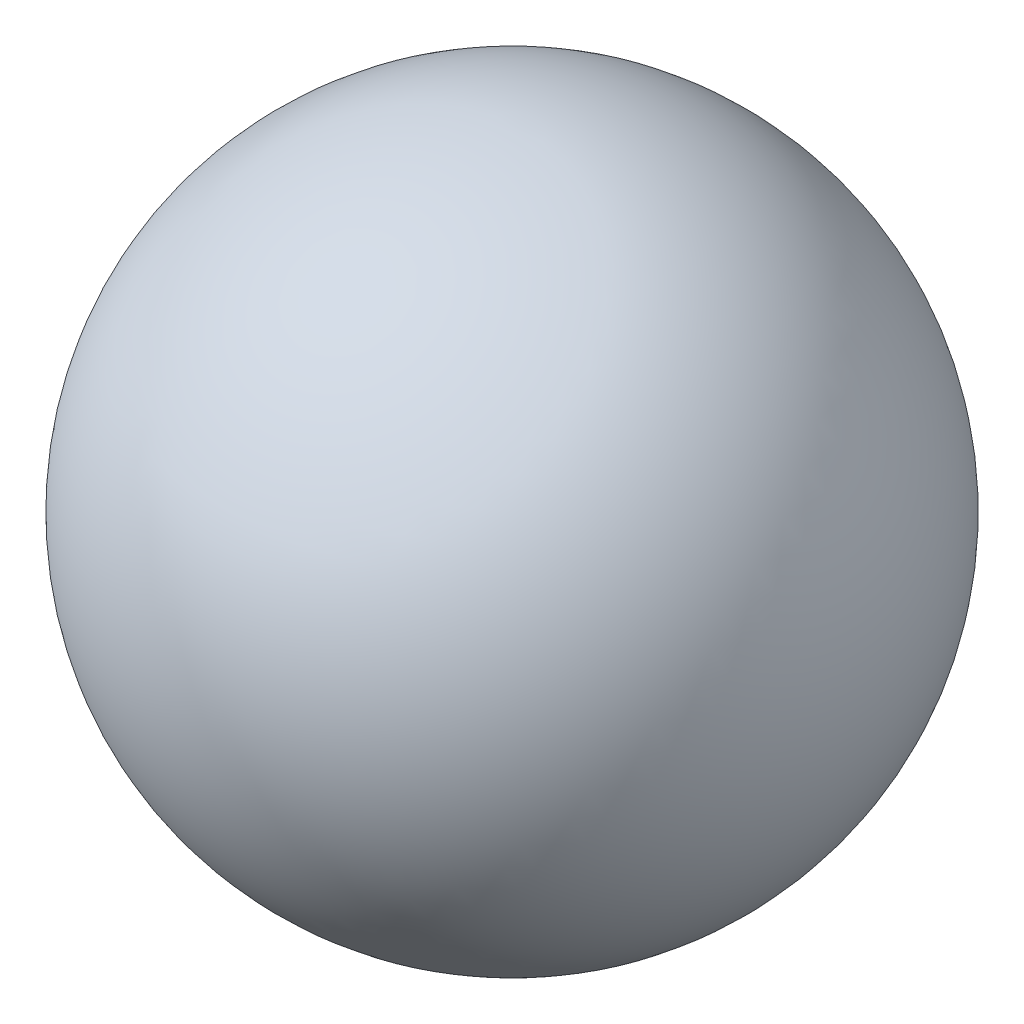
ISO-10303-21;
HEADER;
FILE_DESCRIPTION(('STEP AP214'),'2;1');
FILE_NAME('part.step','',(''),(''),'','','');
FILE_SCHEMA(('AUTOMOTIVE_DESIGN { 1 0 10303 214 1 1 1 1 }'));
ENDSEC;
DATA;
#1=APPLICATION_CONTEXT('core data for automotive mechanical design processes');
#2=APPLICATION_PROTOCOL_DEFINITION('international standard','automotive_design',2000,#1);
#3=PRODUCT_CONTEXT('',#1,'mechanical');
#4=PRODUCT('Part','Part','',(#3));
#5=PRODUCT_RELATED_PRODUCT_CATEGORY('part','',(#4));
#6=PRODUCT_DEFINITION_FORMATION('','',#4);
#7=PRODUCT_DEFINITION_CONTEXT('part definition',#1,'design');
#8=PRODUCT_DEFINITION('design','',#6,#7);
#9=PRODUCT_DEFINITION_SHAPE('','',#8);
#10=(LENGTH_UNIT() NAMED_UNIT(*) SI_UNIT(.MILLI.,.METRE.));
#11=(NAMED_UNIT(*) PLANE_ANGLE_UNIT() SI_UNIT($,.RADIAN.));
#12=(NAMED_UNIT(*) SI_UNIT($,.STERADIAN.) SOLID_ANGLE_UNIT());
#13=UNCERTAINTY_MEASURE_WITH_UNIT(LENGTH_MEASURE(1.E-05),#10,'distance_accuracy_value','');
#14=(GEOMETRIC_REPRESENTATION_CONTEXT(3) GLOBAL_UNCERTAINTY_ASSIGNED_CONTEXT((#13)) GLOBAL_UNIT_ASSIGNED_CONTEXT((#10,
#11,#12)) REPRESENTATION_CONTEXT('',''));
#15=CARTESIAN_POINT('',(0.,0.,0.));
#16=DIRECTION('',(0.,0.,1.));
#17=DIRECTION('',(1.,0.,0.));
#18=AXIS2_PLACEMENT_3D('',#15,#16,#17);
#19=CARTESIAN_POINT('',(0.,0.,0.));
#20=DIRECTION('',(0.,1.,0.));
#21=DIRECTION('',(1.,0.,0.));
#22=AXIS2_PLACEMENT_3D('',#19,#20,#21);
#23=SPHERICAL_SURFACE('',#22,3.571875);
#24=CARTESIAN_POINT('',(0.,3.571875,0.));
#25=VERTEX_POINT('',#24);
#26=VERTEX_LOOP('',#25);
#27=FACE_BOUND('',#26,.T.);
#28=ADVANCED_FACE('F35',(#27),#23,.T.);
#29=CLOSED_SHELL('',(#28));
#30=MANIFOLD_SOLID_BREP('B2',#29);
#31=ADVANCED_BREP_SHAPE_REPRESENTATION('',(#18,#30),#14);
#32=SHAPE_DEFINITION_REPRESENTATION(#9,#31);
ENDSEC;
END-ISO-10303-21;
